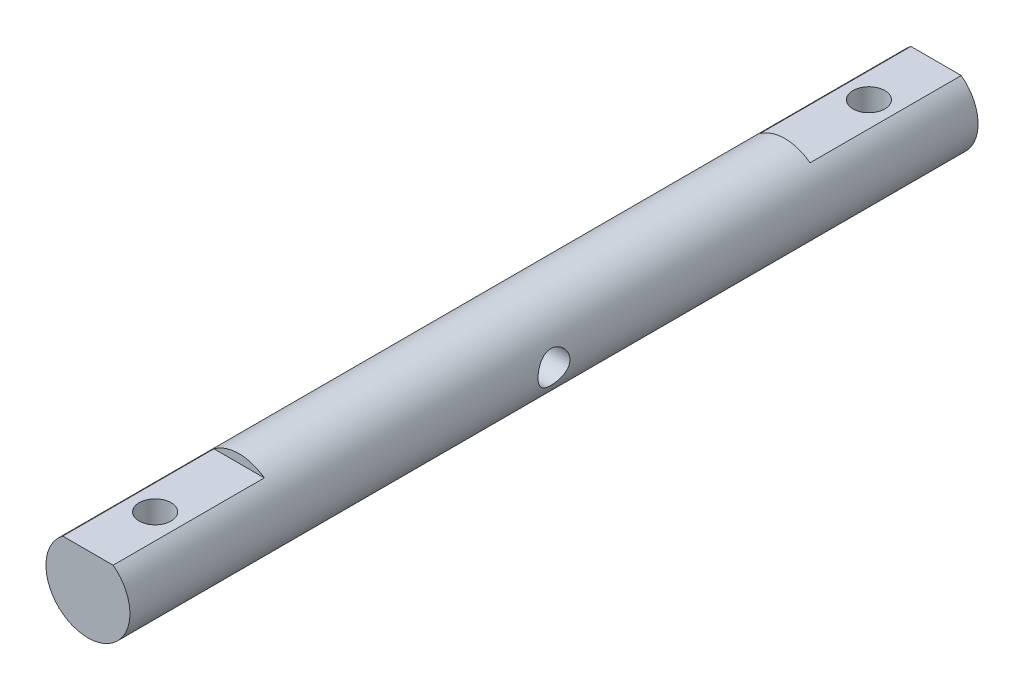
ISO-10303-21;
HEADER;
FILE_DESCRIPTION(('STEP AP214'),'2;1');
FILE_NAME('part.step','',(''),(''),'','','');
FILE_SCHEMA(('AUTOMOTIVE_DESIGN { 1 0 10303 214 1 1 1 1 }'));
ENDSEC;
DATA;
#1=APPLICATION_CONTEXT('core data for automotive mechanical design processes');
#2=APPLICATION_PROTOCOL_DEFINITION('international standard','automotive_design',2000,#1);
#3=PRODUCT_CONTEXT('',#1,'mechanical');
#4=PRODUCT('Part','Part','',(#3));
#5=PRODUCT_RELATED_PRODUCT_CATEGORY('part','',(#4));
#6=PRODUCT_DEFINITION_FORMATION('','',#4);
#7=PRODUCT_DEFINITION_CONTEXT('part definition',#1,'design');
#8=PRODUCT_DEFINITION('design','',#6,#7);
#9=PRODUCT_DEFINITION_SHAPE('','',#8);
#10=(LENGTH_UNIT() NAMED_UNIT(*) SI_UNIT(.MILLI.,.METRE.));
#11=(NAMED_UNIT(*) PLANE_ANGLE_UNIT() SI_UNIT($,.RADIAN.));
#12=(NAMED_UNIT(*) SI_UNIT($,.STERADIAN.) SOLID_ANGLE_UNIT());
#13=UNCERTAINTY_MEASURE_WITH_UNIT(LENGTH_MEASURE(1.E-05),#10,'distance_accuracy_value','');
#14=(GEOMETRIC_REPRESENTATION_CONTEXT(3) GLOBAL_UNCERTAINTY_ASSIGNED_CONTEXT((#13)) GLOBAL_UNIT_ASSIGNED_CONTEXT((#10,
#11,#12)) REPRESENTATION_CONTEXT('',''));
#15=CARTESIAN_POINT('',(0.,0.,0.));
#16=DIRECTION('',(0.,0.,1.));
#17=DIRECTION('',(1.,0.,0.));
#18=AXIS2_PLACEMENT_3D('',#15,#16,#17);
#19=CARTESIAN_POINT('',(0.,0.,50.5));
#20=DIRECTION('',(0.,0.,-1.));
#21=DIRECTION('',(-1.,0.,0.));
#22=AXIS2_PLACEMENT_3D('',#19,#20,#21);
#23=CYLINDRICAL_SURFACE('',#22,5.);
#24=CARTESIAN_POINT('',(-5.,0.,1.9));
#25=CARTESIAN_POINT('',(-5.00000314148827,-0.102799946037765,1.90000415381577));
#26=CARTESIAN_POINT('',(-4.99680228989486,-0.205571843604519,1.89163106638686));
#27=CARTESIAN_POINT('',(-4.98435404669264,-0.408038934279459,1.85849983997184));
#28=CARTESIAN_POINT('',(-4.97510770315697,-0.507734657550122,1.83374454106912));
#29=CARTESIAN_POINT('',(-4.9515593739685,-0.701099790647796,1.76885442206358));
#30=CARTESIAN_POINT('',(-4.93726730476453,-0.794780597920969,1.72874975542084));
#31=CARTESIAN_POINT('',(-4.90504670913708,-0.974076337852587,1.63445483907035));
#32=CARTESIAN_POINT('',(-4.88711718065938,-1.05968903835505,1.58026070680921));
#33=CARTESIAN_POINT('',(-4.84859789590344,-1.22413732997016,1.45686832356389));
#34=CARTESIAN_POINT('',(-4.82793146758365,-1.30257632185067,1.38716568208657));
#35=CARTESIAN_POINT('',(-4.7866396882284,-1.44697300442312,1.2358056302591));
#36=CARTESIAN_POINT('',(-4.76601435231863,-1.51292672431605,1.15414443122143));
#37=CARTESIAN_POINT('',(-4.72624148165763,-1.63303669782607,0.977270759607275));
#38=CARTESIAN_POINT('',(-4.70718397732858,-1.68662691351059,0.881651623266012));
#39=CARTESIAN_POINT('',(-4.67390104311853,-1.77678814062093,0.681919984592406));
#40=CARTESIAN_POINT('',(-4.65967362483106,-1.81336615777595,0.577810999228982));
#41=CARTESIAN_POINT('',(-4.63848318884947,-1.86688935206445,0.368624907006327));
#42=CARTESIAN_POINT('',(-4.63124079326371,-1.88459286653868,0.263771102988575));
#43=CARTESIAN_POINT('',(-4.62402433436697,-1.9022352797225,0.0523500758217513));
#44=CARTESIAN_POINT('',(-4.62404716488918,-1.90218177025023,-0.0542163956088432));
#45=CARTESIAN_POINT('',(-4.63111820371223,-1.88489047329825,-0.259033249608669));
#46=CARTESIAN_POINT('',(-4.63773273521278,-1.86871346296971,-0.357390962648222));
#47=CARTESIAN_POINT('',(-4.65651975451297,-1.82139096396027,-0.549873783457343));
#48=CARTESIAN_POINT('',(-4.66869310243304,-1.79024315879619,-0.643998233733779));
#49=CARTESIAN_POINT('',(-4.69748147158025,-1.71329420545471,-0.827473712822987));
#50=CARTESIAN_POINT('',(-4.71417741416087,-1.66722275924216,-0.916698121922093));
#51=CARTESIAN_POINT('',(-4.75010374416888,-1.56192297174274,-1.08645385764242));
#52=CARTESIAN_POINT('',(-4.76933502200296,-1.50269000311216,-1.16698211202574));
#53=CARTESIAN_POINT('',(-4.80978709665352,-1.36792669110658,-1.32291885227451));
#54=CARTESIAN_POINT('',(-4.83105350406012,-1.29155254717806,-1.39758809653555));
#55=CARTESIAN_POINT('',(-4.87203874292135,-1.12712495183049,-1.53328193745198));
#56=CARTESIAN_POINT('',(-4.89175732325386,-1.03906961144242,-1.59430432297494));
#57=CARTESIAN_POINT('',(-4.92783612775859,-0.851852487995204,-1.70181709832506));
#58=CARTESIAN_POINT('',(-4.94413653388479,-0.752533399397338,-1.74805507331473));
#59=CARTESIAN_POINT('',(-4.97109705743368,-0.54675211735048,-1.8229191856317));
#60=CARTESIAN_POINT('',(-4.98175974975373,-0.440293209930097,-1.85155336406638));
#61=CARTESIAN_POINT('',(-4.9957875569285,-0.229470984419312,-1.88896149494266));
#62=CARTESIAN_POINT('',(-4.99951788872478,-0.125308381952606,-1.8987305140866));
#63=CARTESIAN_POINT('',(-5.00039355163115,0.0832228861010034,-1.90103642794049));
#64=CARTESIAN_POINT('',(-4.99754038959186,0.187591499072481,-1.89357726588996));
#65=CARTESIAN_POINT('',(-4.98581030398745,0.389231183311321,-1.86239025498067));
#66=CARTESIAN_POINT('',(-4.97717686326153,0.48661956252922,-1.83931960487263));
#67=CARTESIAN_POINT('',(-4.95500073108836,0.676070523965439,-1.77843546753041));
#68=CARTESIAN_POINT('',(-4.9414574019024,0.768132412531034,-1.74062006507222));
#69=CARTESIAN_POINT('',(-4.91029493799233,0.947380130569953,-1.65010632845678));
#70=CARTESIAN_POINT('',(-4.89256680627251,1.0343402755648,-1.59699974496449));
#71=CARTESIAN_POINT('',(-4.85498822454556,1.19840935888328,-1.47787083372912));
#72=CARTESIAN_POINT('',(-4.83513697776912,1.27551457482178,-1.41184364933531));
#73=CARTESIAN_POINT('',(-4.79402533228151,1.42249454419624,-1.26412025587449));
#74=CARTESIAN_POINT('',(-4.77275146045522,1.4916645142899,-1.18172473214307));
#75=CARTESIAN_POINT('',(-4.73232674163432,1.61534182230436,-1.00608504575801));
#76=CARTESIAN_POINT('',(-4.71317611359821,1.66984764881774,-0.912839766256889));
#77=CARTESIAN_POINT('',(-4.67922676081744,1.76275609269656,-0.717262006723308));
#78=CARTESIAN_POINT('',(-4.66445090027486,1.80107453812967,-0.61488530080581));
#79=CARTESIAN_POINT('',(-4.64140564627876,1.85966772399062,-0.404411570340142));
#80=CARTESIAN_POINT('',(-4.63313207948134,1.87995403901349,-0.296318262491006));
#81=CARTESIAN_POINT('',(-4.62459224889872,1.90085822079159,-0.0851395001695923));
#82=CARTESIAN_POINT('',(-4.62383507549612,1.90268207203628,0.0178076648693764));
#83=CARTESIAN_POINT('',(-4.62914978373433,1.88971442556339,0.222460530233509));
#84=CARTESIAN_POINT('',(-4.63522098096587,1.87492459303962,0.324166353945867));
#85=CARTESIAN_POINT('',(-4.65309482864239,1.83009780463443,0.520119894369563));
#86=CARTESIAN_POINT('',(-4.66470670311429,1.80056695115269,0.614502298812342));
#87=CARTESIAN_POINT('',(-4.69223770514172,1.72754746605826,0.79702476865041));
#88=CARTESIAN_POINT('',(-4.70815793493193,1.68405526209124,0.885163229325843));
#89=CARTESIAN_POINT('',(-4.74356958481196,1.5816535247205,1.05781732736853));
#90=CARTESIAN_POINT('',(-4.76320634926203,1.52204449455647,1.14188789304858));
#91=CARTESIAN_POINT('',(-4.80334974018232,1.39017194395784,1.29921747533249));
#92=CARTESIAN_POINT('',(-4.82385664524132,1.3179043471688,1.37247299519233));
#93=CARTESIAN_POINT('',(-4.86481333859486,1.15791728108036,1.51029299174753));
#94=CARTESIAN_POINT('',(-4.88519522839751,1.06955792182773,1.57413824127065));
#95=CARTESIAN_POINT('',(-4.92239876122345,0.882645995081791,1.68606111869897));
#96=CARTESIAN_POINT('',(-4.93921996278201,0.7840921659001,1.73413679185081));
#97=CARTESIAN_POINT('',(-4.96815335096176,0.573841256525994,1.81495483162383));
#98=CARTESIAN_POINT('',(-4.97995793401086,0.461720234475096,1.84671559467441));
#99=CARTESIAN_POINT('',(-4.99587741203959,0.233052523820141,1.88923018017531));
#100=CARTESIAN_POINT('',(-4.99999643959643,0.11650824805077,1.89999529227576));
#101=CARTESIAN_POINT('',(-5.,0.,1.9));
#102=B_SPLINE_CURVE_WITH_KNOTS('',3,(#24,#25,#26,#27,#28,#29,#30,#31,#32,#33,#34,#35,#36,#37,
#38,#39,#40,#41,#42,#43,#44,#45,#46,#47,#48,#49,#50,#51,#52,#53,#54,#55,#56,#57,#58,#59,#60,#61,
#62,#63,#64,#65,#66,#67,#68,#69,#70,#71,#72,#73,#74,#75,#76,#77,#78,#79,#80,#81,#82,#83,#84,#85,
#86,#87,#88,#89,#90,#91,#92,#93,#94,#95,#96,#97,#98,#99,#100,#101),.UNSPECIFIED.,.T.,.F.,(4,2,2,
2,2,2,2,2,2,2,2,2,2,2,2,2,2,2,2,2,2,2,2,2,2,2,2,2,2,2,2,2,2,2,2,2,2,2,4),(0.,0.307969989814318,
0.615886602745027,0.923201400237973,1.2306009726375,1.55003648986385,1.86957342987414,
2.20167819314484,2.53364607224951,2.85170573798024,3.16962942101276,3.46793160007379,
3.76627995133595,4.07036626171805,4.37455965276768,4.69979074570955,5.02507449610576,
5.35564718353277,5.68606875870782,5.99852705660325,6.31091384516211,6.6109067417509,
6.91093861797689,7.21987153759842,7.52892080407884,7.85638861100008,8.18389015653176,
8.51307430166362,8.84204699477762,9.14938038628981,9.45668297644511,9.75409402108916,
10.0515812263923,10.3649606558095,10.6784411868815,11.0095285310712,11.3406569004431,
11.6898823114545,12.0389198873331),.UNSPECIFIED.);
#103=CARTESIAN_POINT('',(-5.,0.,1.9));
#104=VERTEX_POINT('',#103);
#105=EDGE_CURVE('E38',#104,#104,#102,.T.);
#106=ORIENTED_EDGE('',*,*,#105,.T.);
#107=EDGE_LOOP('',(#106));
#108=FACE_BOUND('',#107,.T.);
#109=CARTESIAN_POINT('',(5.,0.,-1.9));
#110=CARTESIAN_POINT('',(5.00000314148827,-0.102799946037765,-1.90000415381577));
#111=CARTESIAN_POINT('',(4.99680228989486,-0.205571843604519,-1.89163106638686));
#112=CARTESIAN_POINT('',(4.98435404669264,-0.408038934279459,-1.85849983997184));
#113=CARTESIAN_POINT('',(4.97510770315697,-0.507734657550122,-1.83374454106912));
#114=CARTESIAN_POINT('',(4.9515593739685,-0.701099790647796,-1.76885442206358));
#115=CARTESIAN_POINT('',(4.93726730476453,-0.794780597920969,-1.72874975542084));
#116=CARTESIAN_POINT('',(4.90504670913708,-0.974076337852587,-1.63445483907035));
#117=CARTESIAN_POINT('',(4.88711718065938,-1.05968903835505,-1.58026070680921));
#118=CARTESIAN_POINT('',(4.84859789590344,-1.22413732997016,-1.45686832356389));
#119=CARTESIAN_POINT('',(4.82793146758365,-1.30257632185067,-1.38716568208657));
#120=CARTESIAN_POINT('',(4.7866396882284,-1.44697300442312,-1.2358056302591));
#121=CARTESIAN_POINT('',(4.76601435231863,-1.51292672431605,-1.15414443122143));
#122=CARTESIAN_POINT('',(4.72624148165763,-1.63303669782607,-0.977270759607275));
#123=CARTESIAN_POINT('',(4.70718397732858,-1.68662691351059,-0.881651623266012));
#124=CARTESIAN_POINT('',(4.67390104311853,-1.77678814062093,-0.681919984592406));
#125=CARTESIAN_POINT('',(4.65967362483106,-1.81336615777595,-0.577810999228982));
#126=CARTESIAN_POINT('',(4.63848318884947,-1.86688935206445,-0.368624907006327));
#127=CARTESIAN_POINT('',(4.63124079326371,-1.88459286653868,-0.263771102988575));
#128=CARTESIAN_POINT('',(4.62402433436697,-1.9022352797225,-0.0523500758217513));
#129=CARTESIAN_POINT('',(4.62404716488918,-1.90218177025023,0.0542163956088432));
#130=CARTESIAN_POINT('',(4.63111820371223,-1.88489047329825,0.259033249608669));
#131=CARTESIAN_POINT('',(4.63773273521278,-1.86871346296971,0.357390962648222));
#132=CARTESIAN_POINT('',(4.65651975451297,-1.82139096396027,0.549873783457343));
#133=CARTESIAN_POINT('',(4.66869310243304,-1.79024315879619,0.643998233733779));
#134=CARTESIAN_POINT('',(4.69748147158025,-1.71329420545471,0.827473712822987));
#135=CARTESIAN_POINT('',(4.71417741416087,-1.66722275924216,0.916698121922093));
#136=CARTESIAN_POINT('',(4.75010374416888,-1.56192297174274,1.08645385764242));
#137=CARTESIAN_POINT('',(4.76933502200296,-1.50269000311216,1.16698211202574));
#138=CARTESIAN_POINT('',(4.80978709665352,-1.36792669110658,1.32291885227451));
#139=CARTESIAN_POINT('',(4.83105350406012,-1.29155254717806,1.39758809653555));
#140=CARTESIAN_POINT('',(4.87203874292135,-1.12712495183049,1.53328193745198));
#141=CARTESIAN_POINT('',(4.89175732325386,-1.03906961144242,1.59430432297494));
#142=CARTESIAN_POINT('',(4.92783612775859,-0.851852487995204,1.70181709832506));
#143=CARTESIAN_POINT('',(4.94413653388479,-0.752533399397338,1.74805507331473));
#144=CARTESIAN_POINT('',(4.97109705743368,-0.54675211735048,1.8229191856317));
#145=CARTESIAN_POINT('',(4.98175974975373,-0.440293209930097,1.85155336406638));
#146=CARTESIAN_POINT('',(4.9957875569285,-0.229470984419312,1.88896149494266));
#147=CARTESIAN_POINT('',(4.99951788872478,-0.125308381952606,1.8987305140866));
#148=CARTESIAN_POINT('',(5.00039355163115,0.0832228861010034,1.90103642794049));
#149=CARTESIAN_POINT('',(4.99754038959186,0.187591499072481,1.89357726588996));
#150=CARTESIAN_POINT('',(4.98581030398745,0.389231183311321,1.86239025498067));
#151=CARTESIAN_POINT('',(4.97717686326153,0.48661956252922,1.83931960487263));
#152=CARTESIAN_POINT('',(4.95500073108836,0.676070523965439,1.77843546753041));
#153=CARTESIAN_POINT('',(4.9414574019024,0.768132412531034,1.74062006507222));
#154=CARTESIAN_POINT('',(4.91029493799233,0.947380130569953,1.65010632845678));
#155=CARTESIAN_POINT('',(4.89256680627251,1.0343402755648,1.59699974496449));
#156=CARTESIAN_POINT('',(4.85498822454556,1.19840935888328,1.47787083372912));
#157=CARTESIAN_POINT('',(4.83513697776912,1.27551457482178,1.41184364933531));
#158=CARTESIAN_POINT('',(4.79402533228151,1.42249454419624,1.26412025587449));
#159=CARTESIAN_POINT('',(4.77275146045522,1.4916645142899,1.18172473214307));
#160=CARTESIAN_POINT('',(4.73232674163432,1.61534182230436,1.00608504575801));
#161=CARTESIAN_POINT('',(4.71317611359821,1.66984764881774,0.912839766256889));
#162=CARTESIAN_POINT('',(4.67922676081744,1.76275609269656,0.717262006723308));
#163=CARTESIAN_POINT('',(4.66445090027486,1.80107453812967,0.61488530080581));
#164=CARTESIAN_POINT('',(4.64140564627876,1.85966772399062,0.404411570340142));
#165=CARTESIAN_POINT('',(4.63313207948134,1.87995403901349,0.296318262491006));
#166=CARTESIAN_POINT('',(4.62459224889872,1.90085822079159,0.0851395001695923));
#167=CARTESIAN_POINT('',(4.62383507549612,1.90268207203628,-0.0178076648693764));
#168=CARTESIAN_POINT('',(4.62914978373433,1.88971442556339,-0.222460530233509));
#169=CARTESIAN_POINT('',(4.63522098096587,1.87492459303962,-0.324166353945867));
#170=CARTESIAN_POINT('',(4.65309482864239,1.83009780463443,-0.520119894369563));
#171=CARTESIAN_POINT('',(4.66470670311429,1.80056695115269,-0.614502298812342));
#172=CARTESIAN_POINT('',(4.69223770514172,1.72754746605826,-0.79702476865041));
#173=CARTESIAN_POINT('',(4.70815793493193,1.68405526209124,-0.885163229325843));
#174=CARTESIAN_POINT('',(4.74356958481196,1.5816535247205,-1.05781732736853));
#175=CARTESIAN_POINT('',(4.76320634926203,1.52204449455647,-1.14188789304858));
#176=CARTESIAN_POINT('',(4.80334974018232,1.39017194395784,-1.29921747533249));
#177=CARTESIAN_POINT('',(4.82385664524132,1.3179043471688,-1.37247299519233));
#178=CARTESIAN_POINT('',(4.86481333859486,1.15791728108036,-1.51029299174753));
#179=CARTESIAN_POINT('',(4.88519522839751,1.06955792182773,-1.57413824127065));
#180=CARTESIAN_POINT('',(4.92239876122345,0.882645995081791,-1.68606111869897));
#181=CARTESIAN_POINT('',(4.93921996278201,0.7840921659001,-1.73413679185081));
#182=CARTESIAN_POINT('',(4.96815335096176,0.573841256525994,-1.81495483162383));
#183=CARTESIAN_POINT('',(4.97995793401086,0.461720234475096,-1.84671559467441));
#184=CARTESIAN_POINT('',(4.99587741203959,0.233052523820141,-1.88923018017531));
#185=CARTESIAN_POINT('',(4.99999643959643,0.11650824805077,-1.89999529227576));
#186=CARTESIAN_POINT('',(5.,0.,-1.9));
#187=B_SPLINE_CURVE_WITH_KNOTS('',3,(#109,#110,#111,#112,#113,#114,#115,#116,#117,#118,#119,
#120,#121,#122,#123,#124,#125,#126,#127,#128,#129,#130,#131,#132,#133,#134,#135,#136,#137,#138,
#139,#140,#141,#142,#143,#144,#145,#146,#147,#148,#149,#150,#151,#152,#153,#154,#155,#156,#157,
#158,#159,#160,#161,#162,#163,#164,#165,#166,#167,#168,#169,#170,#171,#172,#173,#174,#175,#176,
#177,#178,#179,#180,#181,#182,#183,#184,#185,#186),.UNSPECIFIED.,.T.,.F.,(4,2,2,2,2,2,2,2,2,2,2,
2,2,2,2,2,2,2,2,2,2,2,2,2,2,2,2,2,2,2,2,2,2,2,2,2,2,2,4),(0.,0.307969989814318,
0.615886602745027,0.923201400237973,1.2306009726375,1.55003648986385,1.86957342987414,
2.20167819314484,2.53364607224951,2.85170573798024,3.16962942101276,3.46793160007379,
3.76627995133595,4.07036626171805,4.37455965276768,4.69979074570955,5.02507449610576,
5.35564718353277,5.68606875870782,5.99852705660325,6.31091384516211,6.6109067417509,
6.91093861797689,7.21987153759842,7.52892080407884,7.85638861100008,8.18389015653176,
8.51307430166362,8.84204699477762,9.14938038628981,9.45668297644511,9.75409402108916,
10.0515812263923,10.3649606558095,10.6784411868815,11.0095285310712,11.3406569004431,
11.6898823114545,12.0389198873331),.UNSPECIFIED.);
#188=CARTESIAN_POINT('',(5.,0.,-1.9));
#189=VERTEX_POINT('',#188);
#190=EDGE_CURVE('E102',#189,#189,#187,.T.);
#191=ORIENTED_EDGE('',*,*,#190,.T.);
#192=EDGE_LOOP('',(#191));
#193=FACE_BOUND('',#192,.T.);
#194=CARTESIAN_POINT('',(0.,-5.,44.4));
#195=CARTESIAN_POINT('',(0.102799946037765,-5.00000314148827,44.4000041538158));
#196=CARTESIAN_POINT('',(0.205571843604519,-4.99680228989486,44.3916310663869));
#197=CARTESIAN_POINT('',(0.40803893427946,-4.98435404669264,44.3584998399718));
#198=CARTESIAN_POINT('',(0.507734657550122,-4.97510770315697,44.3337445410691));
#199=CARTESIAN_POINT('',(0.701099790647797,-4.9515593739685,44.2688544220636));
#200=CARTESIAN_POINT('',(0.79478059792097,-4.93726730476453,44.2287497554208));
#201=CARTESIAN_POINT('',(0.974076337852588,-4.90504670913707,44.1344548390704));
#202=CARTESIAN_POINT('',(1.05968903835505,-4.88711718065938,44.0802607068092));
#203=CARTESIAN_POINT('',(1.22413732997016,-4.84859789590344,43.9568683235639));
#204=CARTESIAN_POINT('',(1.30257632185067,-4.82793146758365,43.8871656820866));
#205=CARTESIAN_POINT('',(1.44697300442312,-4.78663968822841,43.7358056302591));
#206=CARTESIAN_POINT('',(1.51292672431606,-4.76601435231863,43.6541444312214));
#207=CARTESIAN_POINT('',(1.63303669782608,-4.72624148165763,43.4772707596073));
#208=CARTESIAN_POINT('',(1.68662691351059,-4.70718397732858,43.381651623266));
#209=CARTESIAN_POINT('',(1.77678814062093,-4.67390104311853,43.1819199845924));
#210=CARTESIAN_POINT('',(1.81336615777595,-4.65967362483106,43.077810999229));
#211=CARTESIAN_POINT('',(1.86688935206445,-4.63848318884947,42.8686249070063));
#212=CARTESIAN_POINT('',(1.88459286653868,-4.63124079326371,42.7637711029886));
#213=CARTESIAN_POINT('',(1.9022352797225,-4.62402433436697,42.5523500758218));
#214=CARTESIAN_POINT('',(1.90218177025023,-4.62404716488918,42.4457836043912));
#215=CARTESIAN_POINT('',(1.88489047329825,-4.63111820371223,42.2409667503913));
#216=CARTESIAN_POINT('',(1.86871346296971,-4.63773273521278,42.1426090373518));
#217=CARTESIAN_POINT('',(1.82139096396027,-4.65651975451297,41.9501262165427));
#218=CARTESIAN_POINT('',(1.79024315879618,-4.66869310243304,41.8560017662662));
#219=CARTESIAN_POINT('',(1.71329420545471,-4.69748147158025,41.672526287177));
#220=CARTESIAN_POINT('',(1.66722275924216,-4.71417741416087,41.5833018780779));
#221=CARTESIAN_POINT('',(1.56192297174274,-4.75010374416888,41.4135461423576));
#222=CARTESIAN_POINT('',(1.50269000311216,-4.76933502200296,41.3330178879743));
#223=CARTESIAN_POINT('',(1.36792669110658,-4.80978709665352,41.1770811477255));
#224=CARTESIAN_POINT('',(1.29155254717806,-4.83105350406012,41.1024119034644));
#225=CARTESIAN_POINT('',(1.12712495183049,-4.87203874292135,40.966718062548));
#226=CARTESIAN_POINT('',(1.03906961144241,-4.89175732325386,40.9056956770251));
#227=CARTESIAN_POINT('',(0.851852487995201,-4.92783612775859,40.7981829016749));
#228=CARTESIAN_POINT('',(0.752533399397334,-4.94413653388479,40.7519449266853));
#229=CARTESIAN_POINT('',(0.546752117350477,-4.97109705743368,40.6770808143683));
#230=CARTESIAN_POINT('',(0.440293209930094,-4.98175974975373,40.6484466359336));
#231=CARTESIAN_POINT('',(0.229470984419311,-4.9957875569285,40.6110385050573));
#232=CARTESIAN_POINT('',(0.125308381952604,-4.99951788872478,40.6012694859134));
#233=CARTESIAN_POINT('',(-0.0832228861010046,-5.00039355163115,40.5989635720595));
#234=CARTESIAN_POINT('',(-0.187591499072482,-4.99754038959186,40.60642273411));
#235=CARTESIAN_POINT('',(-0.389231183311322,-4.98581030398745,40.6376097450193));
#236=CARTESIAN_POINT('',(-0.48661956252922,-4.97717686326153,40.6606803951274));
#237=CARTESIAN_POINT('',(-0.67607052396544,-4.95500073108836,40.7215645324696));
#238=CARTESIAN_POINT('',(-0.768132412531035,-4.9414574019024,40.7593799349278));
#239=CARTESIAN_POINT('',(-0.947380130569956,-4.91029493799233,40.8498936715432));
#240=CARTESIAN_POINT('',(-1.0343402755648,-4.89256680627251,40.9030002550355));
#241=CARTESIAN_POINT('',(-1.19840935888329,-4.85498822454556,41.0221291662709));
#242=CARTESIAN_POINT('',(-1.27551457482178,-4.83513697776912,41.0881563506647));
#243=CARTESIAN_POINT('',(-1.42249454419624,-4.79402533228151,41.2358797441255));
#244=CARTESIAN_POINT('',(-1.4916645142899,-4.77275146045522,41.3182752678569));
#245=CARTESIAN_POINT('',(-1.61534182230436,-4.73232674163432,41.493914954242));
#246=CARTESIAN_POINT('',(-1.66984764881774,-4.71317611359821,41.5871602337431));
#247=CARTESIAN_POINT('',(-1.76275609269656,-4.67922676081744,41.7827379932767));
#248=CARTESIAN_POINT('',(-1.80107453812967,-4.66445090027486,41.8851146991942));
#249=CARTESIAN_POINT('',(-1.85966772399062,-4.64140564627876,42.0955884296599));
#250=CARTESIAN_POINT('',(-1.87995403901348,-4.63313207948134,42.203681737509));
#251=CARTESIAN_POINT('',(-1.90085822079159,-4.62459224889872,42.4148604998304));
#252=CARTESIAN_POINT('',(-1.90268207203628,-4.62383507549612,42.5178076648694));
#253=CARTESIAN_POINT('',(-1.88971442556339,-4.62914978373433,42.7224605302335));
#254=CARTESIAN_POINT('',(-1.87492459303962,-4.63522098096587,42.8241663539459));
#255=CARTESIAN_POINT('',(-1.83009780463443,-4.65309482864239,43.0201198943696));
#256=CARTESIAN_POINT('',(-1.80056695115268,-4.66470670311429,43.1145022988123));
#257=CARTESIAN_POINT('',(-1.72754746605826,-4.69223770514173,43.2970247686504));
#258=CARTESIAN_POINT('',(-1.68405526209124,-4.70815793493194,43.3851632293259));
#259=CARTESIAN_POINT('',(-1.5816535247205,-4.74356958481196,43.5578173273685));
#260=CARTESIAN_POINT('',(-1.52204449455646,-4.76320634926203,43.6418878930486));
#261=CARTESIAN_POINT('',(-1.39017194395784,-4.80334974018232,43.7992174753325));
#262=CARTESIAN_POINT('',(-1.3179043471688,-4.82385664524133,43.8724729951923));
#263=CARTESIAN_POINT('',(-1.15791728108036,-4.86481333859486,44.0102929917475));
#264=CARTESIAN_POINT('',(-1.06955792182773,-4.88519522839751,44.0741382412707));
#265=CARTESIAN_POINT('',(-0.882645995081788,-4.92239876122345,44.186061118699));
#266=CARTESIAN_POINT('',(-0.784092165900097,-4.93921996278201,44.2341367918508));
#267=CARTESIAN_POINT('',(-0.573841256525992,-4.96815335096177,44.3149548316238));
#268=CARTESIAN_POINT('',(-0.461720234475094,-4.97995793401086,44.3467155946744));
#269=CARTESIAN_POINT('',(-0.23305252382014,-4.99587741203959,44.3892301801753));
#270=CARTESIAN_POINT('',(-0.11650824805077,-4.99999643959643,44.3999952922758));
#271=CARTESIAN_POINT('',(0.,-5.,44.4));
#272=B_SPLINE_CURVE_WITH_KNOTS('',3,(#194,#195,#196,#197,#198,#199,#200,#201,#202,#203,#204,
#205,#206,#207,#208,#209,#210,#211,#212,#213,#214,#215,#216,#217,#218,#219,#220,#221,#222,#223,
#224,#225,#226,#227,#228,#229,#230,#231,#232,#233,#234,#235,#236,#237,#238,#239,#240,#241,#242,
#243,#244,#245,#246,#247,#248,#249,#250,#251,#252,#253,#254,#255,#256,#257,#258,#259,#260,#261,
#262,#263,#264,#265,#266,#267,#268,#269,#270,#271),.UNSPECIFIED.,.T.,.F.,(4,2,2,2,2,2,2,2,2,2,2,
2,2,2,2,2,2,2,2,2,2,2,2,2,2,2,2,2,2,2,2,2,2,2,2,2,2,2,4),(0.,0.307969989814319,
0.615886602745028,0.923201400237977,1.2306009726375,1.55003648986385,1.86957342987415,
2.20167819314485,2.53364607224951,2.85170573798024,3.16962942101276,3.46793160007379,
3.76627995133595,4.07036626171805,4.37455965276767,4.69979074570955,5.02507449610576,
5.35564718353277,5.68606875870781,5.99852705660325,6.31091384516211,6.6109067417509,
6.91093861797689,7.21987153759842,7.52892080407884,7.85638861100008,8.18389015653175,
8.51307430166361,8.84204699477761,9.1493803862898,9.45668297644511,9.75409402108916,
10.0515812263923,10.3649606558095,10.6784411868815,11.0095285310712,11.3406569004431,
11.6898823114545,12.0389198873331),.UNSPECIFIED.);
#273=CARTESIAN_POINT('',(0.,-5.,44.4));
#274=VERTEX_POINT('',#273);
#275=EDGE_CURVE('E143',#274,#274,#272,.T.);
#276=ORIENTED_EDGE('',*,*,#275,.T.);
#277=EDGE_LOOP('',(#276));
#278=FACE_BOUND('',#277,.T.);
#279=CARTESIAN_POINT('',(0.,-5.,-40.6));
#280=CARTESIAN_POINT('',(0.102799946037765,-5.00000314148827,-40.5999958461842));
#281=CARTESIAN_POINT('',(0.205571843604519,-4.99680228989486,-40.6083689336131));
#282=CARTESIAN_POINT('',(0.40803893427946,-4.98435404669264,-40.6415001600282));
#283=CARTESIAN_POINT('',(0.507734657550122,-4.97510770315697,-40.6662554589309));
#284=CARTESIAN_POINT('',(0.701099790647797,-4.9515593739685,-40.7311455779364));
#285=CARTESIAN_POINT('',(0.79478059792097,-4.93726730476453,-40.7712502445792));
#286=CARTESIAN_POINT('',(0.974076337852588,-4.90504670913707,-40.8655451609297));
#287=CARTESIAN_POINT('',(1.05968903835505,-4.88711718065938,-40.9197392931908));
#288=CARTESIAN_POINT('',(1.22413732997016,-4.84859789590344,-41.0431316764361));
#289=CARTESIAN_POINT('',(1.30257632185067,-4.82793146758365,-41.1128343179134));
#290=CARTESIAN_POINT('',(1.44697300442312,-4.78663968822841,-41.2641943697409));
#291=CARTESIAN_POINT('',(1.51292672431606,-4.76601435231863,-41.3458555687786));
#292=CARTESIAN_POINT('',(1.63303669782608,-4.72624148165763,-41.5227292403927));
#293=CARTESIAN_POINT('',(1.68662691351059,-4.70718397732858,-41.618348376734));
#294=CARTESIAN_POINT('',(1.77678814062093,-4.67390104311853,-41.8180800154076));
#295=CARTESIAN_POINT('',(1.81336615777595,-4.65967362483106,-41.922189000771));
#296=CARTESIAN_POINT('',(1.86688935206445,-4.63848318884947,-42.1313750929937));
#297=CARTESIAN_POINT('',(1.88459286653868,-4.63124079326371,-42.2362288970114));
#298=CARTESIAN_POINT('',(1.9022352797225,-4.62402433436697,-42.4476499241783));
#299=CARTESIAN_POINT('',(1.90218177025023,-4.62404716488918,-42.5542163956088));
#300=CARTESIAN_POINT('',(1.88489047329825,-4.63111820371223,-42.7590332496087));
#301=CARTESIAN_POINT('',(1.86871346296971,-4.63773273521278,-42.8573909626482));
#302=CARTESIAN_POINT('',(1.82139096396027,-4.65651975451297,-43.0498737834574));
#303=CARTESIAN_POINT('',(1.79024315879618,-4.66869310243304,-43.1439982337338));
#304=CARTESIAN_POINT('',(1.71329420545471,-4.69748147158025,-43.327473712823));
#305=CARTESIAN_POINT('',(1.66722275924216,-4.71417741416087,-43.4166981219221));
#306=CARTESIAN_POINT('',(1.56192297174274,-4.75010374416888,-43.5864538576424));
#307=CARTESIAN_POINT('',(1.50269000311216,-4.76933502200296,-43.6669821120257));
#308=CARTESIAN_POINT('',(1.36792669110658,-4.80978709665352,-43.8229188522745));
#309=CARTESIAN_POINT('',(1.29155254717806,-4.83105350406012,-43.8975880965356));
#310=CARTESIAN_POINT('',(1.12712495183049,-4.87203874292135,-44.033281937452));
#311=CARTESIAN_POINT('',(1.03906961144241,-4.89175732325386,-44.0943043229749));
#312=CARTESIAN_POINT('',(0.851852487995202,-4.92783612775859,-44.2018170983251));
#313=CARTESIAN_POINT('',(0.752533399397337,-4.94413653388479,-44.2480550733147));
#314=CARTESIAN_POINT('',(0.54675211735048,-4.97109705743367,-44.3229191856317));
#315=CARTESIAN_POINT('',(0.440293209930096,-4.98175974975373,-44.3515533640664));
#316=CARTESIAN_POINT('',(0.229470984419311,-4.9957875569285,-44.3889614949427));
#317=CARTESIAN_POINT('',(0.125308381952604,-4.99951788872478,-44.3987305140866));
#318=CARTESIAN_POINT('',(-0.0832228861010046,-5.00039355163115,-44.4010364279405));
#319=CARTESIAN_POINT('',(-0.187591499072482,-4.99754038959186,-44.39357726589));
#320=CARTESIAN_POINT('',(-0.389231183311322,-4.98581030398745,-44.3623902549807));
#321=CARTESIAN_POINT('',(-0.48661956252922,-4.97717686326153,-44.3393196048726));
#322=CARTESIAN_POINT('',(-0.67607052396544,-4.95500073108836,-44.2784354675304));
#323=CARTESIAN_POINT('',(-0.768132412531036,-4.9414574019024,-44.2406200650722));
#324=CARTESIAN_POINT('',(-0.947380130569954,-4.91029493799233,-44.1501063284568));
#325=CARTESIAN_POINT('',(-1.0343402755648,-4.89256680627251,-44.0969997449645));
#326=CARTESIAN_POINT('',(-1.19840935888328,-4.85498822454556,-43.9778708337291));
#327=CARTESIAN_POINT('',(-1.27551457482178,-4.83513697776912,-43.9118436493353));
#328=CARTESIAN_POINT('',(-1.42249454419624,-4.79402533228151,-43.7641202558745));
#329=CARTESIAN_POINT('',(-1.4916645142899,-4.77275146045522,-43.6817247321431));
#330=CARTESIAN_POINT('',(-1.61534182230436,-4.73232674163432,-43.506085045758));
#331=CARTESIAN_POINT('',(-1.66984764881774,-4.71317611359821,-43.4128397662569));
#332=CARTESIAN_POINT('',(-1.76275609269656,-4.67922676081744,-43.2172620067233));
#333=CARTESIAN_POINT('',(-1.80107453812967,-4.66445090027486,-43.1148853008058));
#334=CARTESIAN_POINT('',(-1.85966772399062,-4.64140564627876,-42.9044115703401));
#335=CARTESIAN_POINT('',(-1.87995403901348,-4.63313207948134,-42.796318262491));
#336=CARTESIAN_POINT('',(-1.90085822079159,-4.62459224889872,-42.5851395001696));
#337=CARTESIAN_POINT('',(-1.90268207203628,-4.62383507549612,-42.4821923351306));
#338=CARTESIAN_POINT('',(-1.88971442556339,-4.62914978373433,-42.2775394697665));
#339=CARTESIAN_POINT('',(-1.87492459303962,-4.63522098096587,-42.1758336460541));
#340=CARTESIAN_POINT('',(-1.83009780463443,-4.65309482864239,-41.9798801056304));
#341=CARTESIAN_POINT('',(-1.80056695115268,-4.66470670311429,-41.8854977011877));
#342=CARTESIAN_POINT('',(-1.72754746605826,-4.69223770514173,-41.7029752313496));
#343=CARTESIAN_POINT('',(-1.68405526209124,-4.70815793493194,-41.6148367706742));
#344=CARTESIAN_POINT('',(-1.5816535247205,-4.74356958481196,-41.4421826726315));
#345=CARTESIAN_POINT('',(-1.52204449455647,-4.76320634926203,-41.3581121069514));
#346=CARTESIAN_POINT('',(-1.39017194395784,-4.80334974018232,-41.2007825246675));
#347=CARTESIAN_POINT('',(-1.3179043471688,-4.82385664524132,-41.1275270048077));
#348=CARTESIAN_POINT('',(-1.15791728108036,-4.86481333859486,-40.9897070082525));
#349=CARTESIAN_POINT('',(-1.06955792182773,-4.88519522839751,-40.9258617587294));
#350=CARTESIAN_POINT('',(-0.88264599508179,-4.92239876122345,-40.813938881301));
#351=CARTESIAN_POINT('',(-0.784092165900098,-4.93921996278201,-40.7658632081492));
#352=CARTESIAN_POINT('',(-0.573841256525993,-4.96815335096177,-40.6850451683762));
#353=CARTESIAN_POINT('',(-0.461720234475095,-4.97995793401086,-40.6532844053256));
#354=CARTESIAN_POINT('',(-0.23305252382014,-4.99587741203959,-40.6107698198247));
#355=CARTESIAN_POINT('',(-0.11650824805077,-4.99999643959643,-40.6000047077243));
#356=CARTESIAN_POINT('',(0.,-5.,-40.6));
#357=B_SPLINE_CURVE_WITH_KNOTS('',3,(#279,#280,#281,#282,#283,#284,#285,#286,#287,#288,#289,
#290,#291,#292,#293,#294,#295,#296,#297,#298,#299,#300,#301,#302,#303,#304,#305,#306,#307,#308,
#309,#310,#311,#312,#313,#314,#315,#316,#317,#318,#319,#320,#321,#322,#323,#324,#325,#326,#327,
#328,#329,#330,#331,#332,#333,#334,#335,#336,#337,#338,#339,#340,#341,#342,#343,#344,#345,#346,
#347,#348,#349,#350,#351,#352,#353,#354,#355,#356),.UNSPECIFIED.,.T.,.F.,(4,2,2,2,2,2,2,2,2,2,2,
2,2,2,2,2,2,2,2,2,2,2,2,2,2,2,2,2,2,2,2,2,2,2,2,2,2,2,4),(0.,0.307969989814319,
0.615886602745028,0.923201400237977,1.2306009726375,1.55003648986385,1.86957342987415,
2.20167819314485,2.53364607224951,2.85170573798024,3.16962942101276,3.46793160007379,
3.76627995133595,4.07036626171805,4.37455965276767,4.69979074570955,5.02507449610576,
5.35564718353277,5.68606875870781,5.99852705660325,6.31091384516211,6.6109067417509,
6.91093861797689,7.21987153759842,7.52892080407884,7.85638861100008,8.18389015653175,
8.51307430166361,8.84204699477761,9.1493803862898,9.45668297644511,9.75409402108916,
10.0515812263923,10.3649606558095,10.6784411868815,11.0095285310712,11.3406569004431,
11.6898823114545,12.0389198873331),.UNSPECIFIED.);
#358=CARTESIAN_POINT('',(0.,-5.,-40.6));
#359=VERTEX_POINT('',#358);
#360=EDGE_CURVE('E136',#359,#359,#357,.T.);
#361=ORIENTED_EDGE('',*,*,#360,.T.);
#362=EDGE_LOOP('',(#361));
#363=FACE_BOUND('',#362,.T.);
#364=CARTESIAN_POINT('',(0.,0.,50.5));
#365=DIRECTION('',(0.,0.,1.));
#366=DIRECTION('',(1.,0.,0.));
#367=AXIS2_PLACEMENT_3D('',#364,#365,#366);
#368=CIRCLE('',#367,5.);
#369=CARTESIAN_POINT('',(-3.,4.,50.5));
#370=VERTEX_POINT('',#369);
#371=CARTESIAN_POINT('',(3.,4.,50.5));
#372=VERTEX_POINT('',#371);
#373=EDGE_CURVE('E95',#370,#372,#368,.T.);
#374=ORIENTED_EDGE('',*,*,#373,.F.);
#375=DIRECTION('',(0.,0.,-1.));
#376=VECTOR('',#375,1.);
#377=CARTESIAN_POINT('',(-3.,4.,50.5));
#378=LINE('',#377,#376);
#379=CARTESIAN_POINT('',(-3.,4.,32.5));
#380=VERTEX_POINT('',#379);
#381=EDGE_CURVE('E55',#370,#380,#378,.T.);
#382=ORIENTED_EDGE('',*,*,#381,.T.);
#383=CARTESIAN_POINT('',(0.,0.,32.5));
#384=DIRECTION('',(0.,0.,1.));
#385=DIRECTION('',(1.,0.,0.));
#386=AXIS2_PLACEMENT_3D('',#383,#384,#385);
#387=CIRCLE('',#386,5.);
#388=CARTESIAN_POINT('',(3.,4.,32.5));
#389=VERTEX_POINT('',#388);
#390=EDGE_CURVE('E47',#389,#380,#387,.T.);
#391=ORIENTED_EDGE('',*,*,#390,.F.);
#392=DIRECTION('',(0.,0.,-1.));
#393=VECTOR('',#392,1.);
#394=CARTESIAN_POINT('',(3.,4.,50.5));
#395=LINE('',#394,#393);
#396=EDGE_CURVE('E80',#389,#372,#395,.F.);
#397=ORIENTED_EDGE('',*,*,#396,.T.);
#398=EDGE_LOOP('',(#374,#382,#391,#397));
#399=FACE_BOUND('',#398,.T.);
#400=CARTESIAN_POINT('',(0.,0.,-32.5));
#401=DIRECTION('',(0.,0.,-1.));
#402=DIRECTION('',(-1.,0.,0.));
#403=AXIS2_PLACEMENT_3D('',#400,#401,#402);
#404=CIRCLE('',#403,5.);
#405=CARTESIAN_POINT('',(-3.,4.,-32.5));
#406=VERTEX_POINT('',#405);
#407=CARTESIAN_POINT('',(3.,4.,-32.5));
#408=VERTEX_POINT('',#407);
#409=EDGE_CURVE('E11',#406,#408,#404,.T.);
#410=ORIENTED_EDGE('',*,*,#409,.F.);
#411=DIRECTION('',(0.,0.,-1.));
#412=VECTOR('',#411,1.);
#413=CARTESIAN_POINT('',(-3.,4.,50.5));
#414=LINE('',#413,#412);
#415=CARTESIAN_POINT('',(-3.,4.,-50.5));
#416=VERTEX_POINT('',#415);
#417=EDGE_CURVE('E144',#406,#416,#414,.T.);
#418=ORIENTED_EDGE('',*,*,#417,.T.);
#419=CARTESIAN_POINT('',(0.,0.,-50.5));
#420=DIRECTION('',(0.,0.,1.));
#421=DIRECTION('',(1.,0.,0.));
#422=AXIS2_PLACEMENT_3D('',#419,#420,#421);
#423=CIRCLE('',#422,5.);
#424=CARTESIAN_POINT('',(3.,4.,-50.5));
#425=VERTEX_POINT('',#424);
#426=EDGE_CURVE('E97',#416,#425,#423,.T.);
#427=ORIENTED_EDGE('',*,*,#426,.T.);
#428=DIRECTION('',(0.,0.,-1.));
#429=VECTOR('',#428,1.);
#430=CARTESIAN_POINT('',(3.,4.,50.5));
#431=LINE('',#430,#429);
#432=EDGE_CURVE('E63',#425,#408,#431,.F.);
#433=ORIENTED_EDGE('',*,*,#432,.T.);
#434=EDGE_LOOP('',(#410,#418,#427,#433));
#435=FACE_BOUND('',#434,.T.);
#436=ADVANCED_FACE('F34',(#108,#193,#278,#363,#399,#435),#23,.T.);
#437=CARTESIAN_POINT('',(0.,0.,50.5));
#438=DIRECTION('',(0.,0.,1.));
#439=DIRECTION('',(1.,0.,0.));
#440=AXIS2_PLACEMENT_3D('',#437,#438,#439);
#441=PLANE('',#440);
#442=DIRECTION('',(1.,0.,0.));
#443=VECTOR('',#442,1.);
#444=CARTESIAN_POINT('',(0.,4.,50.5));
#445=LINE('',#444,#443);
#446=EDGE_CURVE('E84',#370,#372,#445,.T.);
#447=ORIENTED_EDGE('',*,*,#446,.F.);
#448=ORIENTED_EDGE('',*,*,#373,.T.);
#449=EDGE_LOOP('',(#447,#448));
#450=FACE_BOUND('',#449,.T.);
#451=ADVANCED_FACE('F167',(#450),#441,.T.);
#452=CARTESIAN_POINT('',(0.,0.,-50.5));
#453=DIRECTION('',(0.,0.,1.));
#454=DIRECTION('',(1.,0.,0.));
#455=AXIS2_PLACEMENT_3D('',#452,#453,#454);
#456=PLANE('',#455);
#457=ORIENTED_EDGE('',*,*,#426,.F.);
#458=DIRECTION('',(1.,0.,0.));
#459=VECTOR('',#458,1.);
#460=CARTESIAN_POINT('',(0.,4.,-50.5));
#461=LINE('',#460,#459);
#462=EDGE_CURVE('E158',#416,#425,#461,.T.);
#463=ORIENTED_EDGE('',*,*,#462,.T.);
#464=EDGE_LOOP('',(#457,#463));
#465=FACE_BOUND('',#464,.T.);
#466=ADVANCED_FACE('F131',(#465),#456,.F.);
#467=CARTESIAN_POINT('',(0.,-35.,-42.5));
#468=DIRECTION('',(0.,1.,0.));
#469=DIRECTION('',(0.,0.,1.));
#470=AXIS2_PLACEMENT_3D('',#467,#468,#469);
#471=CYLINDRICAL_SURFACE('',#470,1.9);
#472=CARTESIAN_POINT('',(0.,4.,-42.5));
#473=DIRECTION('',(0.,-1.,0.));
#474=DIRECTION('',(0.,0.,-1.));
#475=AXIS2_PLACEMENT_3D('',#472,#473,#474);
#476=CIRCLE('',#475,1.9);
#477=CARTESIAN_POINT('',(0.,4.,-44.4));
#478=VERTEX_POINT('',#477);
#479=EDGE_CURVE('E100',#478,#478,#476,.F.);
#480=ORIENTED_EDGE('',*,*,#479,.T.);
#481=EDGE_LOOP('',(#480));
#482=FACE_BOUND('',#481,.T.);
#483=ORIENTED_EDGE('',*,*,#360,.F.);
#484=EDGE_LOOP('',(#483));
#485=FACE_BOUND('',#484,.T.);
#486=ADVANCED_FACE('F127',(#482,#485),#471,.F.);
#487=CARTESIAN_POINT('',(0.,-35.,42.5));
#488=DIRECTION('',(0.,1.,0.));
#489=DIRECTION('',(0.,0.,1.));
#490=AXIS2_PLACEMENT_3D('',#487,#488,#489);
#491=CYLINDRICAL_SURFACE('',#490,1.9);
#492=CARTESIAN_POINT('',(0.,4.,42.5));
#493=DIRECTION('',(0.,-1.,0.));
#494=DIRECTION('',(0.,0.,-1.));
#495=AXIS2_PLACEMENT_3D('',#492,#493,#494);
#496=CIRCLE('',#495,1.9);
#497=CARTESIAN_POINT('',(0.,4.,40.6));
#498=VERTEX_POINT('',#497);
#499=EDGE_CURVE('E149',#498,#498,#496,.F.);
#500=ORIENTED_EDGE('',*,*,#499,.T.);
#501=EDGE_LOOP('',(#500));
#502=FACE_BOUND('',#501,.T.);
#503=ORIENTED_EDGE('',*,*,#275,.F.);
#504=EDGE_LOOP('',(#503));
#505=FACE_BOUND('',#504,.T.);
#506=ADVANCED_FACE('F126',(#502,#505),#491,.F.);
#507=CARTESIAN_POINT('',(-19.8648719236266,40.,32.5));
#508=DIRECTION('',(0.,0.,1.));
#509=DIRECTION('',(1.,0.,0.));
#510=AXIS2_PLACEMENT_3D('',#507,#508,#509);
#511=PLANE('',#510);
#512=ORIENTED_EDGE('',*,*,#390,.T.);
#513=DIRECTION('',(-1.,0.,0.));
#514=VECTOR('',#513,1.);
#515=CARTESIAN_POINT('',(-19.8648719236266,4.,32.5));
#516=LINE('',#515,#514);
#517=EDGE_CURVE('E83',#389,#380,#516,.T.);
#518=ORIENTED_EDGE('',*,*,#517,.F.);
#519=EDGE_LOOP('',(#512,#518));
#520=FACE_BOUND('',#519,.T.);
#521=ADVANCED_FACE('F91',(#520),#511,.T.);
#522=CARTESIAN_POINT('',(0.,4.,0.));
#523=DIRECTION('',(0.,-1.,0.));
#524=DIRECTION('',(0.,0.,-1.));
#525=AXIS2_PLACEMENT_3D('',#522,#523,#524);
#526=PLANE('',#525);
#527=ORIENTED_EDGE('',*,*,#499,.F.);
#528=EDGE_LOOP('',(#527));
#529=FACE_BOUND('',#528,.T.);
#530=ORIENTED_EDGE('',*,*,#446,.T.);
#531=ORIENTED_EDGE('',*,*,#396,.F.);
#532=ORIENTED_EDGE('',*,*,#517,.T.);
#533=ORIENTED_EDGE('',*,*,#381,.F.);
#534=EDGE_LOOP('',(#530,#531,#532,#533));
#535=FACE_BOUND('',#534,.T.);
#536=ADVANCED_FACE('F82',(#529,#535),#526,.F.);
#537=CARTESIAN_POINT('',(-9.65113477301338,40.,-32.5));
#538=DIRECTION('',(0.,0.,-1.));
#539=DIRECTION('',(-1.,0.,0.));
#540=AXIS2_PLACEMENT_3D('',#537,#538,#539);
#541=PLANE('',#540);
#542=ORIENTED_EDGE('',*,*,#409,.T.);
#543=DIRECTION('',(1.,0.,0.));
#544=VECTOR('',#543,1.);
#545=CARTESIAN_POINT('',(-9.65113477301338,4.,-32.5));
#546=LINE('',#545,#544);
#547=EDGE_CURVE('E92',#406,#408,#546,.T.);
#548=ORIENTED_EDGE('',*,*,#547,.F.);
#549=EDGE_LOOP('',(#542,#548));
#550=FACE_BOUND('',#549,.T.);
#551=ADVANCED_FACE('F116',(#550),#541,.T.);
#552=CARTESIAN_POINT('',(0.,4.,0.));
#553=DIRECTION('',(0.,-1.,0.));
#554=DIRECTION('',(0.,0.,-1.));
#555=AXIS2_PLACEMENT_3D('',#552,#553,#554);
#556=PLANE('',#555);
#557=ORIENTED_EDGE('',*,*,#479,.F.);
#558=EDGE_LOOP('',(#557));
#559=FACE_BOUND('',#558,.T.);
#560=ORIENTED_EDGE('',*,*,#547,.T.);
#561=ORIENTED_EDGE('',*,*,#432,.F.);
#562=ORIENTED_EDGE('',*,*,#462,.F.);
#563=ORIENTED_EDGE('',*,*,#417,.F.);
#564=EDGE_LOOP('',(#560,#561,#562,#563));
#565=FACE_BOUND('',#564,.T.);
#566=ADVANCED_FACE('F111',(#559,#565),#556,.F.);
#567=CARTESIAN_POINT('',(-18.,0.,0.));
#568=DIRECTION('',(1.,0.,0.));
#569=DIRECTION('',(0.,0.,-1.));
#570=AXIS2_PLACEMENT_3D('',#567,#568,#569);
#571=CYLINDRICAL_SURFACE('',#570,1.9);
#572=ORIENTED_EDGE('',*,*,#190,.F.);
#573=EDGE_LOOP('',(#572));
#574=FACE_BOUND('',#573,.T.);
#575=ORIENTED_EDGE('',*,*,#105,.F.);
#576=EDGE_LOOP('',(#575));
#577=FACE_BOUND('',#576,.T.);
#578=ADVANCED_FACE('F107',(#574,#577),#571,.F.);
#579=CLOSED_SHELL('',(#436,#451,#466,#486,#506,#521,#536,#551,#566,#578));
#580=MANIFOLD_SOLID_BREP('B2',#579);
#581=ADVANCED_BREP_SHAPE_REPRESENTATION('',(#18,#580),#14);
#582=SHAPE_DEFINITION_REPRESENTATION(#9,#581);
ENDSEC;
END-ISO-10303-21;
